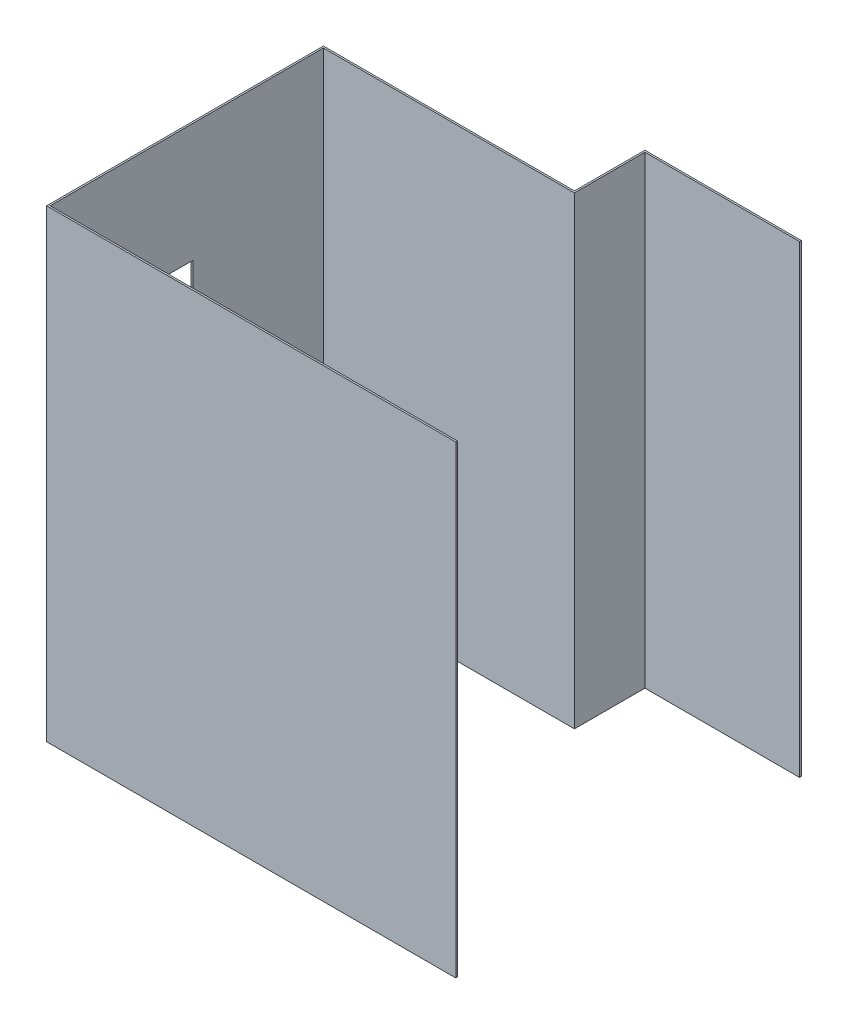
ISO-10303-21;
HEADER;
FILE_DESCRIPTION(('STEP AP214'),'2;1');
FILE_NAME('part.step','',(''),(''),'','','');
FILE_SCHEMA(('AUTOMOTIVE_DESIGN { 1 0 10303 214 1 1 1 1 }'));
ENDSEC;
DATA;
#1=APPLICATION_CONTEXT('core data for automotive mechanical design processes');
#2=APPLICATION_PROTOCOL_DEFINITION('international standard','automotive_design',2000,#1);
#3=PRODUCT_CONTEXT('',#1,'mechanical');
#4=PRODUCT('Part','Part','',(#3));
#5=PRODUCT_RELATED_PRODUCT_CATEGORY('part','',(#4));
#6=PRODUCT_DEFINITION_FORMATION('','',#4);
#7=PRODUCT_DEFINITION_CONTEXT('part definition',#1,'design');
#8=PRODUCT_DEFINITION('design','',#6,#7);
#9=PRODUCT_DEFINITION_SHAPE('','',#8);
#10=(LENGTH_UNIT() NAMED_UNIT(*) SI_UNIT(.MILLI.,.METRE.));
#11=(NAMED_UNIT(*) PLANE_ANGLE_UNIT() SI_UNIT($,.RADIAN.));
#12=(NAMED_UNIT(*) SI_UNIT($,.STERADIAN.) SOLID_ANGLE_UNIT());
#13=UNCERTAINTY_MEASURE_WITH_UNIT(LENGTH_MEASURE(1.E-05),#10,'distance_accuracy_value','');
#14=(GEOMETRIC_REPRESENTATION_CONTEXT(3) GLOBAL_UNCERTAINTY_ASSIGNED_CONTEXT((#13)) GLOBAL_UNIT_ASSIGNED_CONTEXT((#10,
#11,#12)) REPRESENTATION_CONTEXT('',''));
#15=CARTESIAN_POINT('',(0.,0.,0.));
#16=DIRECTION('',(0.,0.,1.));
#17=DIRECTION('',(1.,0.,0.));
#18=AXIS2_PLACEMENT_3D('',#15,#16,#17);
#19=CARTESIAN_POINT('',(-730.,-1350.,10.));
#20=DIRECTION('',(0.,1.,0.));
#21=DIRECTION('',(0.,0.,1.));
#22=AXIS2_PLACEMENT_3D('',#19,#20,#21);
#23=PLANE('',#22);
#24=DIRECTION('',(0.,0.,1.));
#25=VECTOR('',#24,1.);
#26=CARTESIAN_POINT('',(-740.,-1350.,1600.));
#27=LINE('',#26,#25);
#28=CARTESIAN_POINT('',(-740.,-1350.,1350.));
#29=VERTEX_POINT('',#28);
#30=CARTESIAN_POINT('',(-740.,-1350.,1610.));
#31=VERTEX_POINT('',#30);
#32=EDGE_CURVE('E186',#29,#31,#27,.T.);
#33=ORIENTED_EDGE('',*,*,#32,.F.);
#34=DIRECTION('',(1.,0.,0.));
#35=VECTOR('',#34,1.);
#36=CARTESIAN_POINT('',(-740.001,-1350.,1350.));
#37=LINE('',#36,#35);
#38=CARTESIAN_POINT('',(-730.,-1350.,1350.));
#39=VERTEX_POINT('',#38);
#40=EDGE_CURVE('E167',#29,#39,#37,.T.);
#41=ORIENTED_EDGE('',*,*,#40,.T.);
#42=DIRECTION('',(0.,0.,1.));
#43=VECTOR('',#42,1.);
#44=CARTESIAN_POINT('',(-730.,-1350.,1600.));
#45=LINE('',#44,#43);
#46=CARTESIAN_POINT('',(-730.,-1350.,1600.));
#47=VERTEX_POINT('',#46);
#48=EDGE_CURVE('E198',#39,#47,#45,.T.);
#49=ORIENTED_EDGE('',*,*,#48,.T.);
#50=DIRECTION('',(1.,0.,0.));
#51=VECTOR('',#50,1.);
#52=CARTESIAN_POINT('',(1640.,-1350.,1600.));
#53=LINE('',#52,#51);
#54=CARTESIAN_POINT('',(1640.,-1350.,1600.));
#55=VERTEX_POINT('',#54);
#56=EDGE_CURVE('E166',#47,#55,#53,.T.);
#57=ORIENTED_EDGE('',*,*,#56,.T.);
#58=DIRECTION('',(0.,0.,-1.));
#59=VECTOR('',#58,1.);
#60=CARTESIAN_POINT('',(1640.,-1350.,1610.));
#61=LINE('',#60,#59);
#62=CARTESIAN_POINT('',(1640.,-1350.,1610.));
#63=VERTEX_POINT('',#62);
#64=EDGE_CURVE('E328',#63,#55,#61,.T.);
#65=ORIENTED_EDGE('',*,*,#64,.F.);
#66=DIRECTION('',(1.,0.,0.));
#67=VECTOR('',#66,1.);
#68=CARTESIAN_POINT('',(1640.,-1350.,1610.));
#69=LINE('',#68,#67);
#70=EDGE_CURVE('E305',#31,#63,#69,.T.);
#71=ORIENTED_EDGE('',*,*,#70,.F.);
#72=EDGE_LOOP('',(#33,#41,#49,#57,#65,#71));
#73=FACE_BOUND('',#72,.T.);
#74=ADVANCED_FACE('F41',(#73),#23,.F.);
#75=CARTESIAN_POINT('',(730.,1350.,10.));
#76=DIRECTION('',(-1.,0.,0.));
#77=DIRECTION('',(0.,-1.,0.));
#78=AXIS2_PLACEMENT_3D('',#75,#76,#77);
#79=PLANE('',#78);
#80=DIRECTION('',(0.,0.,-1.));
#81=VECTOR('',#80,1.);
#82=CARTESIAN_POINT('',(730.,-1350.,10.));
#83=LINE('',#82,#81);
#84=CARTESIAN_POINT('',(730.,-1350.,10.));
#85=VERTEX_POINT('',#84);
#86=CARTESIAN_POINT('',(730.,-1350.,-400.));
#87=VERTEX_POINT('',#86);
#88=EDGE_CURVE('E262',#85,#87,#83,.T.);
#89=ORIENTED_EDGE('',*,*,#88,.T.);
#90=DIRECTION('',(0.,1.,0.));
#91=VECTOR('',#90,1.);
#92=CARTESIAN_POINT('',(730.,1350.,-400.));
#93=LINE('',#92,#91);
#94=CARTESIAN_POINT('',(730.,1350.,-400.));
#95=VERTEX_POINT('',#94);
#96=EDGE_CURVE('E237',#87,#95,#93,.T.);
#97=ORIENTED_EDGE('',*,*,#96,.T.);
#98=DIRECTION('',(0.,0.,-1.));
#99=VECTOR('',#98,1.);
#100=CARTESIAN_POINT('',(730.,1350.,10.));
#101=LINE('',#100,#99);
#102=CARTESIAN_POINT('',(730.,1350.,10.));
#103=VERTEX_POINT('',#102);
#104=EDGE_CURVE('E50',#103,#95,#101,.T.);
#105=ORIENTED_EDGE('',*,*,#104,.F.);
#106=DIRECTION('',(0.,1.,0.));
#107=VECTOR('',#106,1.);
#108=CARTESIAN_POINT('',(730.,1350.,10.));
#109=LINE('',#108,#107);
#110=EDGE_CURVE('E249',#85,#103,#109,.T.);
#111=ORIENTED_EDGE('',*,*,#110,.F.);
#112=EDGE_LOOP('',(#89,#97,#105,#111));
#113=FACE_BOUND('',#112,.T.);
#114=ADVANCED_FACE('F43',(#113),#79,.F.);
#115=CARTESIAN_POINT('',(-730.,1350.,10.));
#116=DIRECTION('',(0.,-1.,0.));
#117=DIRECTION('',(0.,0.,-1.));
#118=AXIS2_PLACEMENT_3D('',#115,#116,#117);
#119=PLANE('',#118);
#120=DIRECTION('',(-1.,0.,0.));
#121=VECTOR('',#120,1.);
#122=CARTESIAN_POINT('',(-730.,1350.,0.));
#123=LINE('',#122,#121);
#124=CARTESIAN_POINT('',(720.,1350.,0.));
#125=VERTEX_POINT('',#124);
#126=CARTESIAN_POINT('',(-740.,1350.,0.));
#127=VERTEX_POINT('',#126);
#128=EDGE_CURVE('E245',#125,#127,#123,.T.);
#129=ORIENTED_EDGE('',*,*,#128,.T.);
#130=DIRECTION('',(0.,0.,-1.));
#131=VECTOR('',#130,1.);
#132=CARTESIAN_POINT('',(-740.,1350.,0.));
#133=LINE('',#132,#131);
#134=CARTESIAN_POINT('',(-740.,1350.,1610.));
#135=VERTEX_POINT('',#134);
#136=EDGE_CURVE('E185',#135,#127,#133,.T.);
#137=ORIENTED_EDGE('',*,*,#136,.F.);
#138=DIRECTION('',(-1.,0.,0.));
#139=VECTOR('',#138,1.);
#140=CARTESIAN_POINT('',(-740.,1350.,1610.));
#141=LINE('',#140,#139);
#142=CARTESIAN_POINT('',(1640.,1350.,1610.));
#143=VERTEX_POINT('',#142);
#144=EDGE_CURVE('E318',#143,#135,#141,.T.);
#145=ORIENTED_EDGE('',*,*,#144,.F.);
#146=DIRECTION('',(0.,0.,-1.));
#147=VECTOR('',#146,1.);
#148=CARTESIAN_POINT('',(1640.,1350.,1610.));
#149=LINE('',#148,#147);
#150=CARTESIAN_POINT('',(1640.,1350.,1600.));
#151=VERTEX_POINT('',#150);
#152=EDGE_CURVE('E321',#143,#151,#149,.T.);
#153=ORIENTED_EDGE('',*,*,#152,.T.);
#154=DIRECTION('',(-1.,0.,0.));
#155=VECTOR('',#154,1.);
#156=CARTESIAN_POINT('',(-740.,1350.,1600.));
#157=LINE('',#156,#155);
#158=CARTESIAN_POINT('',(-730.,1350.,1600.));
#159=VERTEX_POINT('',#158);
#160=EDGE_CURVE('E306',#151,#159,#157,.T.);
#161=ORIENTED_EDGE('',*,*,#160,.T.);
#162=DIRECTION('',(0.,0.,-1.));
#163=VECTOR('',#162,1.);
#164=CARTESIAN_POINT('',(-730.,1350.,0.));
#165=LINE('',#164,#163);
#166=CARTESIAN_POINT('',(-730.,1350.,10.));
#167=VERTEX_POINT('',#166);
#168=EDGE_CURVE('E202',#159,#167,#165,.T.);
#169=ORIENTED_EDGE('',*,*,#168,.T.);
#170=DIRECTION('',(-1.,0.,0.));
#171=VECTOR('',#170,1.);
#172=CARTESIAN_POINT('',(-730.,1350.,10.));
#173=LINE('',#172,#171);
#174=EDGE_CURVE('E252',#103,#167,#173,.T.);
#175=ORIENTED_EDGE('',*,*,#174,.F.);
#176=ORIENTED_EDGE('',*,*,#104,.T.);
#177=DIRECTION('',(1.,0.,0.));
#178=VECTOR('',#177,1.);
#179=CARTESIAN_POINT('',(720.,1350.,-400.));
#180=LINE('',#179,#178);
#181=CARTESIAN_POINT('',(1630.,1350.,-400.));
#182=VERTEX_POINT('',#181);
#183=EDGE_CURVE('E190',#95,#182,#180,.T.);
#184=ORIENTED_EDGE('',*,*,#183,.T.);
#185=DIRECTION('',(0.,0.,1.));
#186=VECTOR('',#185,1.);
#187=CARTESIAN_POINT('',(1630.,1350.,-410.));
#188=LINE('',#187,#186);
#189=CARTESIAN_POINT('',(1630.,1350.,-410.));
#190=VERTEX_POINT('',#189);
#191=EDGE_CURVE('E233',#190,#182,#188,.T.);
#192=ORIENTED_EDGE('',*,*,#191,.F.);
#193=DIRECTION('',(1.,0.,0.));
#194=VECTOR('',#193,1.);
#195=CARTESIAN_POINT('',(720.,1350.,-410.));
#196=LINE('',#195,#194);
#197=CARTESIAN_POINT('',(720.,1350.,-410.));
#198=VERTEX_POINT('',#197);
#199=EDGE_CURVE('E210',#198,#190,#196,.T.);
#200=ORIENTED_EDGE('',*,*,#199,.F.);
#201=DIRECTION('',(0.,0.,1.));
#202=VECTOR('',#201,1.);
#203=CARTESIAN_POINT('',(720.,1350.,10.));
#204=LINE('',#203,#202);
#205=EDGE_CURVE('E241',#198,#125,#204,.T.);
#206=ORIENTED_EDGE('',*,*,#205,.T.);
#207=EDGE_LOOP('',(#129,#137,#145,#153,#161,#169,#175,#176,#184,#192,#200,#206));
#208=FACE_BOUND('',#207,.T.);
#209=ADVANCED_FACE('F273',(#208),#119,.F.);
#210=CARTESIAN_POINT('',(-730.,-1350.,10.));
#211=VERTEX_POINT('',#210);
#212=CARTESIAN_POINT('',(-730.,-1350.,770.));
#213=VERTEX_POINT('',#212);
#214=EDGE_CURVE('E176',#211,#213,#45,.T.);
#215=ORIENTED_EDGE('',*,*,#214,.T.);
#216=DIRECTION('',(1.,0.,0.));
#217=VECTOR('',#216,1.);
#218=CARTESIAN_POINT('',(-740.001,-1350.,770.));
#219=LINE('',#218,#217);
#220=CARTESIAN_POINT('',(-740.,-1350.,770.));
#221=VERTEX_POINT('',#220);
#222=EDGE_CURVE('E160',#221,#213,#219,.T.);
#223=ORIENTED_EDGE('',*,*,#222,.F.);
#224=CARTESIAN_POINT('',(-740.,-1350.,0.));
#225=VERTEX_POINT('',#224);
#226=EDGE_CURVE('E174',#225,#221,#27,.T.);
#227=ORIENTED_EDGE('',*,*,#226,.F.);
#228=DIRECTION('',(1.,0.,0.));
#229=VECTOR('',#228,1.);
#230=CARTESIAN_POINT('',(-730.,-1350.,0.));
#231=LINE('',#230,#229);
#232=CARTESIAN_POINT('',(720.,-1350.,0.));
#233=VERTEX_POINT('',#232);
#234=EDGE_CURVE('E253',#225,#233,#231,.T.);
#235=ORIENTED_EDGE('',*,*,#234,.T.);
#236=DIRECTION('',(0.,0.,-1.));
#237=VECTOR('',#236,1.);
#238=CARTESIAN_POINT('',(720.,-1350.,10.));
#239=LINE('',#238,#237);
#240=CARTESIAN_POINT('',(720.,-1350.,-410.));
#241=VERTEX_POINT('',#240);
#242=EDGE_CURVE('E238',#233,#241,#239,.T.);
#243=ORIENTED_EDGE('',*,*,#242,.T.);
#244=DIRECTION('',(-1.,0.,0.));
#245=VECTOR('',#244,1.);
#246=CARTESIAN_POINT('',(720.,-1350.,-410.));
#247=LINE('',#246,#245);
#248=CARTESIAN_POINT('',(1630.,-1350.,-410.));
#249=VERTEX_POINT('',#248);
#250=EDGE_CURVE('E217',#249,#241,#247,.T.);
#251=ORIENTED_EDGE('',*,*,#250,.F.);
#252=DIRECTION('',(0.,0.,1.));
#253=VECTOR('',#252,1.);
#254=CARTESIAN_POINT('',(1630.,-1350.,-410.));
#255=LINE('',#254,#253);
#256=CARTESIAN_POINT('',(1630.,-1350.,-400.));
#257=VERTEX_POINT('',#256);
#258=EDGE_CURVE('E221',#249,#257,#255,.T.);
#259=ORIENTED_EDGE('',*,*,#258,.T.);
#260=DIRECTION('',(-1.,0.,0.));
#261=VECTOR('',#260,1.);
#262=CARTESIAN_POINT('',(720.,-1350.,-400.));
#263=LINE('',#262,#261);
#264=EDGE_CURVE('E211',#257,#87,#263,.T.);
#265=ORIENTED_EDGE('',*,*,#264,.T.);
#266=ORIENTED_EDGE('',*,*,#88,.F.);
#267=DIRECTION('',(1.,0.,0.));
#268=VECTOR('',#267,1.);
#269=CARTESIAN_POINT('',(-730.,-1350.,10.));
#270=LINE('',#269,#268);
#271=EDGE_CURVE('E65',#211,#85,#270,.T.);
#272=ORIENTED_EDGE('',*,*,#271,.F.);
#273=EDGE_LOOP('',(#215,#223,#227,#235,#243,#251,#259,#265,#266,#272));
#274=FACE_BOUND('',#273,.T.);
#275=ADVANCED_FACE('F172',(#274),#23,.F.);
#276=CARTESIAN_POINT('',(0.,0.,10.));
#277=DIRECTION('',(0.,0.,1.));
#278=DIRECTION('',(1.,0.,0.));
#279=AXIS2_PLACEMENT_3D('',#276,#277,#278);
#280=PLANE('',#279);
#281=ORIENTED_EDGE('',*,*,#271,.T.);
#282=ORIENTED_EDGE('',*,*,#110,.T.);
#283=ORIENTED_EDGE('',*,*,#174,.T.);
#284=DIRECTION('',(0.,-1.,0.));
#285=VECTOR('',#284,1.);
#286=CARTESIAN_POINT('',(-730.,1350.,10.));
#287=LINE('',#286,#285);
#288=EDGE_CURVE('E257',#167,#211,#287,.T.);
#289=ORIENTED_EDGE('',*,*,#288,.T.);
#290=EDGE_LOOP('',(#281,#282,#283,#289));
#291=FACE_BOUND('',#290,.T.);
#292=ADVANCED_FACE('F368',(#291),#280,.T.);
#293=CARTESIAN_POINT('',(0.,0.,0.));
#294=DIRECTION('',(0.,0.,1.));
#295=DIRECTION('',(1.,0.,0.));
#296=AXIS2_PLACEMENT_3D('',#293,#294,#295);
#297=PLANE('',#296);
#298=ORIENTED_EDGE('',*,*,#128,.F.);
#299=DIRECTION('',(0.,-1.,0.));
#300=VECTOR('',#299,1.);
#301=CARTESIAN_POINT('',(720.,1.1842378929335E-13,0.));
#302=LINE('',#301,#300);
#303=EDGE_CURVE('E11',#125,#233,#302,.T.);
#304=ORIENTED_EDGE('',*,*,#303,.T.);
#305=ORIENTED_EDGE('',*,*,#234,.F.);
#306=DIRECTION('',(0.,-1.,0.));
#307=VECTOR('',#306,1.);
#308=CARTESIAN_POINT('',(-740.,-1350.,0.));
#309=LINE('',#308,#307);
#310=EDGE_CURVE('E183',#127,#225,#309,.T.);
#311=ORIENTED_EDGE('',*,*,#310,.F.);
#312=EDGE_LOOP('',(#298,#304,#305,#311));
#313=FACE_BOUND('',#312,.T.);
#314=ADVANCED_FACE('F294',(#313),#297,.F.);
#315=CARTESIAN_POINT('',(720.,1.18834983006174E-13,0.));
#316=DIRECTION('',(-1.,0.,0.));
#317=DIRECTION('',(0.,-1.,0.));
#318=AXIS2_PLACEMENT_3D('',#315,#316,#317);
#319=PLANE('',#318);
#320=ORIENTED_EDGE('',*,*,#303,.F.);
#321=ORIENTED_EDGE('',*,*,#205,.F.);
#322=DIRECTION('',(0.,1.,0.));
#323=VECTOR('',#322,1.);
#324=CARTESIAN_POINT('',(720.,1350.,-410.));
#325=LINE('',#324,#323);
#326=EDGE_CURVE('E206',#241,#198,#325,.T.);
#327=ORIENTED_EDGE('',*,*,#326,.F.);
#328=ORIENTED_EDGE('',*,*,#242,.F.);
#329=EDGE_LOOP('',(#320,#321,#327,#328));
#330=FACE_BOUND('',#329,.T.);
#331=ADVANCED_FACE('F292',(#330),#319,.T.);
#332=CARTESIAN_POINT('',(0.,0.,-400.));
#333=DIRECTION('',(0.,0.,1.));
#334=DIRECTION('',(0.,-1.,0.));
#335=AXIS2_PLACEMENT_3D('',#332,#333,#334);
#336=PLANE('',#335);
#337=ORIENTED_EDGE('',*,*,#96,.F.);
#338=ORIENTED_EDGE('',*,*,#264,.F.);
#339=DIRECTION('',(0.,-1.,0.));
#340=VECTOR('',#339,1.);
#341=CARTESIAN_POINT('',(1630.,-1350.,-400.));
#342=LINE('',#341,#340);
#343=EDGE_CURVE('E224',#182,#257,#342,.T.);
#344=ORIENTED_EDGE('',*,*,#343,.F.);
#345=ORIENTED_EDGE('',*,*,#183,.F.);
#346=EDGE_LOOP('',(#337,#338,#344,#345));
#347=FACE_BOUND('',#346,.T.);
#348=ADVANCED_FACE('F279',(#347),#336,.T.);
#349=CARTESIAN_POINT('',(1630.,-1350.,-410.));
#350=DIRECTION('',(-1.,0.,0.));
#351=DIRECTION('',(0.,0.,1.));
#352=AXIS2_PLACEMENT_3D('',#349,#350,#351);
#353=PLANE('',#352);
#354=ORIENTED_EDGE('',*,*,#343,.T.);
#355=ORIENTED_EDGE('',*,*,#258,.F.);
#356=DIRECTION('',(0.,-1.,0.));
#357=VECTOR('',#356,1.);
#358=CARTESIAN_POINT('',(1630.,-1350.,-410.));
#359=LINE('',#358,#357);
#360=EDGE_CURVE('E214',#190,#249,#359,.T.);
#361=ORIENTED_EDGE('',*,*,#360,.F.);
#362=ORIENTED_EDGE('',*,*,#191,.T.);
#363=EDGE_LOOP('',(#354,#355,#361,#362));
#364=FACE_BOUND('',#363,.T.);
#365=ADVANCED_FACE('F285',(#364),#353,.F.);
#366=CARTESIAN_POINT('',(0.,0.,-410.));
#367=DIRECTION('',(0.,0.,1.));
#368=DIRECTION('',(0.,-1.,0.));
#369=AXIS2_PLACEMENT_3D('',#366,#367,#368);
#370=PLANE('',#369);
#371=ORIENTED_EDGE('',*,*,#326,.T.);
#372=ORIENTED_EDGE('',*,*,#199,.T.);
#373=ORIENTED_EDGE('',*,*,#360,.T.);
#374=ORIENTED_EDGE('',*,*,#250,.T.);
#375=EDGE_LOOP('',(#371,#372,#373,#374));
#376=FACE_BOUND('',#375,.T.);
#377=ADVANCED_FACE('F290',(#376),#370,.F.);
#378=CARTESIAN_POINT('',(-730.,-1.20068564144647E-13,0.));
#379=DIRECTION('',(1.,0.,0.));
#380=DIRECTION('',(0.,1.,0.));
#381=AXIS2_PLACEMENT_3D('',#378,#379,#380);
#382=PLANE('',#381);
#383=DIRECTION('',(0.,-1.,0.));
#384=VECTOR('',#383,1.);
#385=CARTESIAN_POINT('',(-730.,-1350.,1350.));
#386=LINE('',#385,#384);
#387=CARTESIAN_POINT('',(-730.,660.,1350.));
#388=VERTEX_POINT('',#387);
#389=EDGE_CURVE('E178',#388,#39,#386,.T.);
#390=ORIENTED_EDGE('',*,*,#389,.F.);
#391=DIRECTION('',(0.,0.,1.));
#392=VECTOR('',#391,1.);
#393=CARTESIAN_POINT('',(-730.,660.,1350.));
#394=LINE('',#393,#392);
#395=CARTESIAN_POINT('',(-730.,660.,770.));
#396=VERTEX_POINT('',#395);
#397=EDGE_CURVE('E524',#396,#388,#394,.T.);
#398=ORIENTED_EDGE('',*,*,#397,.F.);
#399=DIRECTION('',(0.,1.,0.));
#400=VECTOR('',#399,1.);
#401=CARTESIAN_POINT('',(-730.,660.,770.));
#402=LINE('',#401,#400);
#403=EDGE_CURVE('E517',#213,#396,#402,.T.);
#404=ORIENTED_EDGE('',*,*,#403,.F.);
#405=ORIENTED_EDGE('',*,*,#214,.F.);
#406=ORIENTED_EDGE('',*,*,#288,.F.);
#407=ORIENTED_EDGE('',*,*,#168,.F.);
#408=DIRECTION('',(0.,1.,0.));
#409=VECTOR('',#408,1.);
#410=CARTESIAN_POINT('',(-730.,1350.,1600.));
#411=LINE('',#410,#409);
#412=EDGE_CURVE('E197',#47,#159,#411,.T.);
#413=ORIENTED_EDGE('',*,*,#412,.F.);
#414=ORIENTED_EDGE('',*,*,#48,.F.);
#415=EDGE_LOOP('',(#390,#398,#404,#405,#406,#407,#413,#414));
#416=FACE_BOUND('',#415,.T.);
#417=ADVANCED_FACE('F343',(#416),#382,.T.);
#418=CARTESIAN_POINT('',(-740.,-1.21302145283119E-13,0.));
#419=DIRECTION('',(1.,0.,0.));
#420=DIRECTION('',(0.,1.,0.));
#421=AXIS2_PLACEMENT_3D('',#418,#419,#420);
#422=PLANE('',#421);
#423=DIRECTION('',(0.,0.,-1.));
#424=VECTOR('',#423,1.);
#425=CARTESIAN_POINT('',(-740.,660.,1350.));
#426=LINE('',#425,#424);
#427=CARTESIAN_POINT('',(-740.,660.,1350.));
#428=VERTEX_POINT('',#427);
#429=CARTESIAN_POINT('',(-740.,660.,770.));
#430=VERTEX_POINT('',#429);
#431=EDGE_CURVE('E57',#428,#430,#426,.T.);
#432=ORIENTED_EDGE('',*,*,#431,.F.);
#433=DIRECTION('',(0.,1.,0.));
#434=VECTOR('',#433,1.);
#435=CARTESIAN_POINT('',(-740.,-1350.,1350.));
#436=LINE('',#435,#434);
#437=EDGE_CURVE('E513',#29,#428,#436,.T.);
#438=ORIENTED_EDGE('',*,*,#437,.F.);
#439=ORIENTED_EDGE('',*,*,#32,.T.);
#440=DIRECTION('',(0.,-1.,0.));
#441=VECTOR('',#440,1.);
#442=CARTESIAN_POINT('',(-740.,-1350.,1610.));
#443=LINE('',#442,#441);
#444=EDGE_CURVE('E299',#135,#31,#443,.T.);
#445=ORIENTED_EDGE('',*,*,#444,.F.);
#446=ORIENTED_EDGE('',*,*,#136,.T.);
#447=ORIENTED_EDGE('',*,*,#310,.T.);
#448=ORIENTED_EDGE('',*,*,#226,.T.);
#449=DIRECTION('',(0.,-1.,0.));
#450=VECTOR('',#449,1.);
#451=CARTESIAN_POINT('',(-740.,660.,770.));
#452=LINE('',#451,#450);
#453=EDGE_CURVE('E156',#430,#221,#452,.T.);
#454=ORIENTED_EDGE('',*,*,#453,.F.);
#455=EDGE_LOOP('',(#432,#438,#439,#445,#446,#447,#448,#454));
#456=FACE_BOUND('',#455,.T.);
#457=ADVANCED_FACE('F180',(#456),#422,.F.);
#458=CARTESIAN_POINT('',(1640.,1350.,1610.));
#459=DIRECTION('',(-1.,0.,0.));
#460=DIRECTION('',(0.,-1.,0.));
#461=AXIS2_PLACEMENT_3D('',#458,#459,#460);
#462=PLANE('',#461);
#463=DIRECTION('',(0.,1.,0.));
#464=VECTOR('',#463,1.);
#465=CARTESIAN_POINT('',(1640.,1350.,1600.));
#466=LINE('',#465,#464);
#467=EDGE_CURVE('E313',#55,#151,#466,.T.);
#468=ORIENTED_EDGE('',*,*,#467,.T.);
#469=ORIENTED_EDGE('',*,*,#152,.F.);
#470=DIRECTION('',(0.,1.,0.));
#471=VECTOR('',#470,1.);
#472=CARTESIAN_POINT('',(1640.,1350.,1610.));
#473=LINE('',#472,#471);
#474=EDGE_CURVE('E310',#63,#143,#473,.T.);
#475=ORIENTED_EDGE('',*,*,#474,.F.);
#476=ORIENTED_EDGE('',*,*,#64,.T.);
#477=EDGE_LOOP('',(#468,#469,#475,#476));
#478=FACE_BOUND('',#477,.T.);
#479=ADVANCED_FACE('F348',(#478),#462,.F.);
#480=CARTESIAN_POINT('',(0.,0.,1610.));
#481=DIRECTION('',(0.,0.,-1.));
#482=DIRECTION('',(-1.,0.,0.));
#483=AXIS2_PLACEMENT_3D('',#480,#481,#482);
#484=PLANE('',#483);
#485=ORIENTED_EDGE('',*,*,#444,.T.);
#486=ORIENTED_EDGE('',*,*,#70,.T.);
#487=ORIENTED_EDGE('',*,*,#474,.T.);
#488=ORIENTED_EDGE('',*,*,#144,.T.);
#489=EDGE_LOOP('',(#485,#486,#487,#488));
#490=FACE_BOUND('',#489,.T.);
#491=ADVANCED_FACE('F349',(#490),#484,.F.);
#492=CARTESIAN_POINT('',(0.,0.,1600.));
#493=DIRECTION('',(0.,0.,-1.));
#494=DIRECTION('',(-1.,0.,0.));
#495=AXIS2_PLACEMENT_3D('',#492,#493,#494);
#496=PLANE('',#495);
#497=ORIENTED_EDGE('',*,*,#56,.F.);
#498=ORIENTED_EDGE('',*,*,#412,.T.);
#499=ORIENTED_EDGE('',*,*,#160,.F.);
#500=ORIENTED_EDGE('',*,*,#467,.F.);
#501=EDGE_LOOP('',(#497,#498,#499,#500));
#502=FACE_BOUND('',#501,.T.);
#503=ADVANCED_FACE('F346',(#502),#496,.T.);
#504=CARTESIAN_POINT('',(-740.001,-1350.,1350.));
#505=DIRECTION('',(0.,0.,1.));
#506=DIRECTION('',(1.,0.,0.));
#507=AXIS2_PLACEMENT_3D('',#504,#505,#506);
#508=PLANE('',#507);
#509=ORIENTED_EDGE('',*,*,#437,.T.);
#510=DIRECTION('',(1.,0.,0.));
#511=VECTOR('',#510,1.);
#512=CARTESIAN_POINT('',(-740.001,660.,1350.));
#513=LINE('',#512,#511);
#514=EDGE_CURVE('E514',#428,#388,#513,.T.);
#515=ORIENTED_EDGE('',*,*,#514,.T.);
#516=ORIENTED_EDGE('',*,*,#389,.T.);
#517=ORIENTED_EDGE('',*,*,#40,.F.);
#518=EDGE_LOOP('',(#509,#515,#516,#517));
#519=FACE_BOUND('',#518,.T.);
#520=ADVANCED_FACE('F356',(#519),#508,.F.);
#521=CARTESIAN_POINT('',(-740.001,660.,1350.));
#522=DIRECTION('',(0.,1.,0.));
#523=DIRECTION('',(-1.,0.,0.));
#524=AXIS2_PLACEMENT_3D('',#521,#522,#523);
#525=PLANE('',#524);
#526=ORIENTED_EDGE('',*,*,#431,.T.);
#527=DIRECTION('',(1.,0.,0.));
#528=VECTOR('',#527,1.);
#529=CARTESIAN_POINT('',(-740.001,660.,770.));
#530=LINE('',#529,#528);
#531=EDGE_CURVE('E162',#430,#396,#530,.T.);
#532=ORIENTED_EDGE('',*,*,#531,.T.);
#533=ORIENTED_EDGE('',*,*,#397,.T.);
#534=ORIENTED_EDGE('',*,*,#514,.F.);
#535=EDGE_LOOP('',(#526,#532,#533,#534));
#536=FACE_BOUND('',#535,.T.);
#537=ADVANCED_FACE('F492',(#536),#525,.F.);
#538=CARTESIAN_POINT('',(-740.001,660.,770.));
#539=DIRECTION('',(0.,0.,-1.));
#540=DIRECTION('',(0.,1.,0.));
#541=AXIS2_PLACEMENT_3D('',#538,#539,#540);
#542=PLANE('',#541);
#543=ORIENTED_EDGE('',*,*,#453,.T.);
#544=ORIENTED_EDGE('',*,*,#222,.T.);
#545=ORIENTED_EDGE('',*,*,#403,.T.);
#546=ORIENTED_EDGE('',*,*,#531,.F.);
#547=EDGE_LOOP('',(#543,#544,#545,#546));
#548=FACE_BOUND('',#547,.T.);
#549=ADVANCED_FACE('F158',(#548),#542,.F.);
#550=CLOSED_SHELL('',(#74,#114,#209,#275,#292,#314,#331,#348,#365,#377,#417,#457,#479,#491,#503,
#520,#537,#549));
#551=MANIFOLD_SOLID_BREP('B2',#550);
#552=ADVANCED_BREP_SHAPE_REPRESENTATION('',(#18,#551),#14);
#553=SHAPE_DEFINITION_REPRESENTATION(#9,#552);
ENDSEC;
END-ISO-10303-21;
